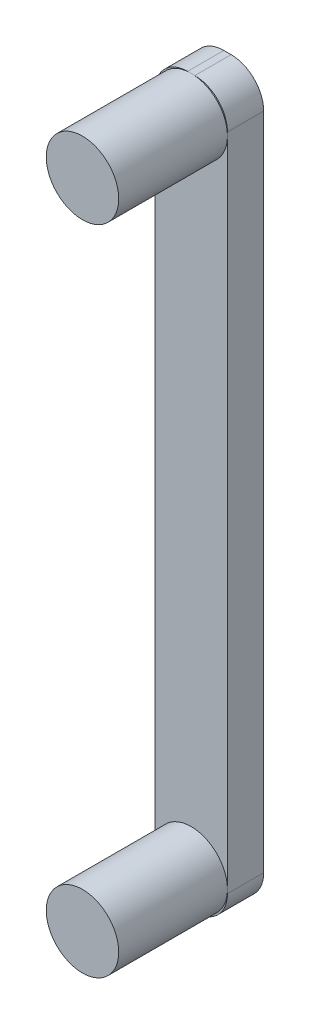
ISO-10303-21;
HEADER;
FILE_DESCRIPTION(('STEP AP214'),'2;1');
FILE_NAME('part.step','',(''),(''),'','','');
FILE_SCHEMA(('AUTOMOTIVE_DESIGN { 1 0 10303 214 1 1 1 1 }'));
ENDSEC;
DATA;
#1=APPLICATION_CONTEXT('core data for automotive mechanical design processes');
#2=APPLICATION_PROTOCOL_DEFINITION('international standard','automotive_design',2000,#1);
#3=PRODUCT_CONTEXT('',#1,'mechanical');
#4=PRODUCT('Part','Part','',(#3));
#5=PRODUCT_RELATED_PRODUCT_CATEGORY('part','',(#4));
#6=PRODUCT_DEFINITION_FORMATION('','',#4);
#7=PRODUCT_DEFINITION_CONTEXT('part definition',#1,'design');
#8=PRODUCT_DEFINITION('design','',#6,#7);
#9=PRODUCT_DEFINITION_SHAPE('','',#8);
#10=(LENGTH_UNIT() NAMED_UNIT(*) SI_UNIT(.MILLI.,.METRE.));
#11=(NAMED_UNIT(*) PLANE_ANGLE_UNIT() SI_UNIT($,.RADIAN.));
#12=(NAMED_UNIT(*) SI_UNIT($,.STERADIAN.) SOLID_ANGLE_UNIT());
#13=UNCERTAINTY_MEASURE_WITH_UNIT(LENGTH_MEASURE(1.E-05),#10,'distance_accuracy_value','');
#14=(GEOMETRIC_REPRESENTATION_CONTEXT(3) GLOBAL_UNCERTAINTY_ASSIGNED_CONTEXT((#13)) GLOBAL_UNIT_ASSIGNED_CONTEXT((#10,
#11,#12)) REPRESENTATION_CONTEXT('',''));
#15=CARTESIAN_POINT('',(0.,0.,0.));
#16=DIRECTION('',(0.,0.,1.));
#17=DIRECTION('',(1.,0.,0.));
#18=AXIS2_PLACEMENT_3D('',#15,#16,#17);
#19=CARTESIAN_POINT('',(-0.099999999999999,-9.1,1.));
#20=DIRECTION('',(0.,0.,1.));
#21=DIRECTION('',(1.,0.,0.));
#22=AXIS2_PLACEMENT_3D('',#19,#20,#21);
#23=PLANE('',#22);
#24=DIRECTION('',(0.,1.,0.));
#25=VECTOR('',#24,1.);
#26=CARTESIAN_POINT('',(0.999999999999999,9.09999999999999,1.));
#27=LINE('',#26,#25);
#28=CARTESIAN_POINT('',(1.,-9.1,1.));
#29=VERTEX_POINT('',#28);
#30=CARTESIAN_POINT('',(1.,-8.99720856712834,1.));
#31=VERTEX_POINT('',#30);
#32=EDGE_CURVE('E124',#29,#31,#27,.T.);
#33=ORIENTED_EDGE('',*,*,#32,.T.);
#34=CARTESIAN_POINT('',(0.,-8.99720856712834,1.));
#35=DIRECTION('',(0.,0.,1.));
#36=DIRECTION('',(1.,0.,0.));
#37=AXIS2_PLACEMENT_3D('',#34,#35,#36);
#38=CIRCLE('',#37,1.);
#39=CARTESIAN_POINT('',(-1.,-8.99720856712834,1.));
#40=VERTEX_POINT('',#39);
#41=EDGE_CURVE('E11',#31,#40,#38,.F.);
#42=ORIENTED_EDGE('',*,*,#41,.T.);
#43=DIRECTION('',(0.,-1.,0.));
#44=VECTOR('',#43,1.);
#45=CARTESIAN_POINT('',(-1.,9.09999999999999,1.));
#46=LINE('',#45,#44);
#47=CARTESIAN_POINT('',(-0.999999999999999,-9.1,1.));
#48=VERTEX_POINT('',#47);
#49=EDGE_CURVE('E121',#40,#48,#46,.T.);
#50=ORIENTED_EDGE('',*,*,#49,.T.);
#51=CARTESIAN_POINT('',(-0.099999999999999,-9.1,1.));
#52=DIRECTION('',(0.,0.,1.));
#53=DIRECTION('',(1.,0.,0.));
#54=AXIS2_PLACEMENT_3D('',#51,#52,#53);
#55=CIRCLE('',#54,0.9);
#56=CARTESIAN_POINT('',(-0.0999999999999923,-10.,1.));
#57=VERTEX_POINT('',#56);
#58=EDGE_CURVE('E158',#48,#57,#55,.T.);
#59=ORIENTED_EDGE('',*,*,#58,.T.);
#60=DIRECTION('',(1.,0.,0.));
#61=VECTOR('',#60,1.);
#62=CARTESIAN_POINT('',(-0.0999999999999923,-10.,1.));
#63=LINE('',#62,#61);
#64=CARTESIAN_POINT('',(0.0999999999999949,-10.,1.));
#65=VERTEX_POINT('',#64);
#66=EDGE_CURVE('E299',#57,#65,#63,.T.);
#67=ORIENTED_EDGE('',*,*,#66,.T.);
#68=CARTESIAN_POINT('',(0.100000000000001,-9.1,1.));
#69=DIRECTION('',(0.,0.,1.));
#70=DIRECTION('',(1.,0.,0.));
#71=AXIS2_PLACEMENT_3D('',#68,#69,#70);
#72=CIRCLE('',#71,0.9);
#73=EDGE_CURVE('E298',#65,#29,#72,.T.);
#74=ORIENTED_EDGE('',*,*,#73,.T.);
#75=EDGE_LOOP('',(#33,#42,#50,#59,#67,#74));
#76=FACE_BOUND('',#75,.T.);
#77=ADVANCED_FACE('F33',(#76),#23,.T.);
#78=CARTESIAN_POINT('',(0.,9.00369428928544,1.));
#79=DIRECTION('',(0.,0.,1.));
#80=DIRECTION('',(1.,0.,0.));
#81=AXIS2_PLACEMENT_3D('',#78,#79,#80);
#82=CIRCLE('',#81,1.);
#83=CARTESIAN_POINT('',(1.,9.00369428928544,1.));
#84=VERTEX_POINT('',#83);
#85=CARTESIAN_POINT('',(0.0858774172734449,10.,1.));
#86=VERTEX_POINT('',#85);
#87=EDGE_CURVE('E255',#84,#86,#82,.T.);
#88=ORIENTED_EDGE('',*,*,#87,.F.);
#89=CARTESIAN_POINT('',(0.999999999999999,9.09999999999999,1.));
#90=VERTEX_POINT('',#89);
#91=EDGE_CURVE('E297',#84,#90,#27,.T.);
#92=ORIENTED_EDGE('',*,*,#91,.T.);
#93=CARTESIAN_POINT('',(0.0999999999999992,9.1,1.));
#94=DIRECTION('',(0.,0.,1.));
#95=DIRECTION('',(-1.,0.,0.));
#96=AXIS2_PLACEMENT_3D('',#93,#94,#95);
#97=CIRCLE('',#96,0.9);
#98=CARTESIAN_POINT('',(0.0999999999999928,10.,1.));
#99=VERTEX_POINT('',#98);
#100=EDGE_CURVE('E251',#90,#99,#97,.T.);
#101=ORIENTED_EDGE('',*,*,#100,.T.);
#102=DIRECTION('',(-1.,0.,0.));
#103=VECTOR('',#102,1.);
#104=CARTESIAN_POINT('',(-0.0999999999999947,10.,1.));
#105=LINE('',#104,#103);
#106=EDGE_CURVE('E192',#99,#86,#105,.T.);
#107=ORIENTED_EDGE('',*,*,#106,.T.);
#108=EDGE_LOOP('',(#88,#92,#101,#107));
#109=FACE_BOUND('',#108,.T.);
#110=ADVANCED_FACE('F226',(#109),#23,.T.);
#111=CARTESIAN_POINT('',(-0.0858774172734449,10.,1.));
#112=VERTEX_POINT('',#111);
#113=CARTESIAN_POINT('',(-1.,9.00369428928544,1.));
#114=VERTEX_POINT('',#113);
#115=EDGE_CURVE('E41',#112,#114,#82,.T.);
#116=ORIENTED_EDGE('',*,*,#115,.F.);
#117=CARTESIAN_POINT('',(-0.0999999999999948,10.,1.));
#118=VERTEX_POINT('',#117);
#119=EDGE_CURVE('E247',#112,#118,#105,.T.);
#120=ORIENTED_EDGE('',*,*,#119,.T.);
#121=CARTESIAN_POINT('',(-0.100000000000001,9.1,1.));
#122=DIRECTION('',(0.,0.,1.));
#123=DIRECTION('',(1.,0.,0.));
#124=AXIS2_PLACEMENT_3D('',#121,#122,#123);
#125=CIRCLE('',#124,0.9);
#126=CARTESIAN_POINT('',(-1.,9.09999999999999,1.));
#127=VERTEX_POINT('',#126);
#128=EDGE_CURVE('E133',#118,#127,#125,.T.);
#129=ORIENTED_EDGE('',*,*,#128,.T.);
#130=EDGE_CURVE('E135',#127,#114,#46,.T.);
#131=ORIENTED_EDGE('',*,*,#130,.T.);
#132=EDGE_LOOP('',(#116,#120,#129,#131));
#133=FACE_BOUND('',#132,.T.);
#134=ADVANCED_FACE('F223',(#133),#23,.T.);
#135=CARTESIAN_POINT('',(-0.099999999999999,-9.1,1.));
#136=DIRECTION('',(0.,0.,-1.));
#137=DIRECTION('',(-1.,0.,0.));
#138=AXIS2_PLACEMENT_3D('',#135,#136,#137);
#139=CYLINDRICAL_SURFACE('',#138,0.9);
#140=CARTESIAN_POINT('',(-0.099999999999999,-9.1,0.));
#141=DIRECTION('',(0.,0.,1.));
#142=DIRECTION('',(1.,0.,0.));
#143=AXIS2_PLACEMENT_3D('',#140,#141,#142);
#144=CIRCLE('',#143,0.9);
#145=CARTESIAN_POINT('',(-0.999999999999999,-9.1,0.));
#146=VERTEX_POINT('',#145);
#147=CARTESIAN_POINT('',(-0.0999999999999923,-10.,0.));
#148=VERTEX_POINT('',#147);
#149=EDGE_CURVE('E140',#146,#148,#144,.T.);
#150=ORIENTED_EDGE('',*,*,#149,.T.);
#151=DIRECTION('',(0.,0.,-1.));
#152=VECTOR('',#151,1.);
#153=CARTESIAN_POINT('',(-0.0999999999999923,-10.,1.));
#154=LINE('',#153,#152);
#155=EDGE_CURVE('E178',#57,#148,#154,.T.);
#156=ORIENTED_EDGE('',*,*,#155,.F.);
#157=ORIENTED_EDGE('',*,*,#58,.F.);
#158=DIRECTION('',(0.,0.,-1.));
#159=VECTOR('',#158,1.);
#160=CARTESIAN_POINT('',(-0.999999999999999,-9.1,1.));
#161=LINE('',#160,#159);
#162=EDGE_CURVE('E131',#48,#146,#161,.T.);
#163=ORIENTED_EDGE('',*,*,#162,.T.);
#164=EDGE_LOOP('',(#150,#156,#157,#163));
#165=FACE_BOUND('',#164,.T.);
#166=ADVANCED_FACE('F35',(#165),#139,.T.);
#167=CARTESIAN_POINT('',(-0.0999999999999923,-10.,1.));
#168=DIRECTION('',(0.,1.,0.));
#169=DIRECTION('',(0.,0.,1.));
#170=AXIS2_PLACEMENT_3D('',#167,#168,#169);
#171=PLANE('',#170);
#172=DIRECTION('',(1.,0.,0.));
#173=VECTOR('',#172,1.);
#174=CARTESIAN_POINT('',(-0.0999999999999923,-10.,0.));
#175=LINE('',#174,#173);
#176=CARTESIAN_POINT('',(0.0999999999999949,-10.,0.));
#177=VERTEX_POINT('',#176);
#178=EDGE_CURVE('E143',#148,#177,#175,.T.);
#179=ORIENTED_EDGE('',*,*,#178,.T.);
#180=DIRECTION('',(0.,0.,-1.));
#181=VECTOR('',#180,1.);
#182=CARTESIAN_POINT('',(0.0999999999999949,-10.,1.));
#183=LINE('',#182,#181);
#184=EDGE_CURVE('E175',#65,#177,#183,.T.);
#185=ORIENTED_EDGE('',*,*,#184,.F.);
#186=ORIENTED_EDGE('',*,*,#66,.F.);
#187=ORIENTED_EDGE('',*,*,#155,.T.);
#188=EDGE_LOOP('',(#179,#185,#186,#187));
#189=FACE_BOUND('',#188,.T.);
#190=ADVANCED_FACE('F216',(#189),#171,.F.);
#191=CARTESIAN_POINT('',(0.100000000000001,-9.1,1.));
#192=DIRECTION('',(0.,0.,-1.));
#193=DIRECTION('',(-1.,0.,0.));
#194=AXIS2_PLACEMENT_3D('',#191,#192,#193);
#195=CYLINDRICAL_SURFACE('',#194,0.9);
#196=CARTESIAN_POINT('',(0.100000000000001,-9.1,0.));
#197=DIRECTION('',(0.,0.,1.));
#198=DIRECTION('',(1.,0.,0.));
#199=AXIS2_PLACEMENT_3D('',#196,#197,#198);
#200=CIRCLE('',#199,0.9);
#201=CARTESIAN_POINT('',(1.,-9.1,0.));
#202=VERTEX_POINT('',#201);
#203=EDGE_CURVE('E146',#177,#202,#200,.T.);
#204=ORIENTED_EDGE('',*,*,#203,.T.);
#205=DIRECTION('',(0.,0.,-1.));
#206=VECTOR('',#205,1.);
#207=CARTESIAN_POINT('',(1.,-9.1,1.));
#208=LINE('',#207,#206);
#209=EDGE_CURVE('E172',#29,#202,#208,.T.);
#210=ORIENTED_EDGE('',*,*,#209,.F.);
#211=ORIENTED_EDGE('',*,*,#73,.F.);
#212=ORIENTED_EDGE('',*,*,#184,.T.);
#213=EDGE_LOOP('',(#204,#210,#211,#212));
#214=FACE_BOUND('',#213,.T.);
#215=ADVANCED_FACE('F213',(#214),#195,.T.);
#216=CARTESIAN_POINT('',(0.999999999999999,9.09999999999999,1.));
#217=DIRECTION('',(-1.,0.,0.));
#218=DIRECTION('',(0.,-1.,0.));
#219=AXIS2_PLACEMENT_3D('',#216,#217,#218);
#220=PLANE('',#219);
#221=DIRECTION('',(0.,1.,0.));
#222=VECTOR('',#221,1.);
#223=CARTESIAN_POINT('',(0.999999999999999,9.09999999999999,0.));
#224=LINE('',#223,#222);
#225=CARTESIAN_POINT('',(0.999999999999999,9.09999999999999,0.));
#226=VERTEX_POINT('',#225);
#227=EDGE_CURVE('E148',#202,#226,#224,.T.);
#228=ORIENTED_EDGE('',*,*,#227,.T.);
#229=DIRECTION('',(0.,0.,-1.));
#230=VECTOR('',#229,1.);
#231=CARTESIAN_POINT('',(0.999999999999999,9.09999999999999,1.));
#232=LINE('',#231,#230);
#233=EDGE_CURVE('E169',#90,#226,#232,.T.);
#234=ORIENTED_EDGE('',*,*,#233,.F.);
#235=ORIENTED_EDGE('',*,*,#91,.F.);
#236=EDGE_CURVE('E296',#31,#84,#27,.T.);
#237=ORIENTED_EDGE('',*,*,#236,.F.);
#238=ORIENTED_EDGE('',*,*,#32,.F.);
#239=ORIENTED_EDGE('',*,*,#209,.T.);
#240=EDGE_LOOP('',(#228,#234,#235,#237,#238,#239));
#241=FACE_BOUND('',#240,.T.);
#242=ADVANCED_FACE('F209',(#241),#220,.F.);
#243=CARTESIAN_POINT('',(0.0999999999999992,9.1,1.));
#244=DIRECTION('',(0.,0.,-1.));
#245=DIRECTION('',(-1.,0.,0.));
#246=AXIS2_PLACEMENT_3D('',#243,#244,#245);
#247=CYLINDRICAL_SURFACE('',#246,0.9);
#248=CARTESIAN_POINT('',(0.0999999999999992,9.1,0.));
#249=DIRECTION('',(0.,0.,1.));
#250=DIRECTION('',(-1.,0.,0.));
#251=AXIS2_PLACEMENT_3D('',#248,#249,#250);
#252=CIRCLE('',#251,0.9);
#253=CARTESIAN_POINT('',(0.0999999999999928,10.,0.));
#254=VERTEX_POINT('',#253);
#255=EDGE_CURVE('E150',#226,#254,#252,.T.);
#256=ORIENTED_EDGE('',*,*,#255,.T.);
#257=DIRECTION('',(0.,0.,-1.));
#258=VECTOR('',#257,1.);
#259=CARTESIAN_POINT('',(0.0999999999999928,10.,1.));
#260=LINE('',#259,#258);
#261=EDGE_CURVE('E166',#99,#254,#260,.T.);
#262=ORIENTED_EDGE('',*,*,#261,.F.);
#263=ORIENTED_EDGE('',*,*,#100,.F.);
#264=ORIENTED_EDGE('',*,*,#233,.T.);
#265=EDGE_LOOP('',(#256,#262,#263,#264));
#266=FACE_BOUND('',#265,.T.);
#267=ADVANCED_FACE('F205',(#266),#247,.T.);
#268=CARTESIAN_POINT('',(-0.0999999999999947,10.,1.));
#269=DIRECTION('',(0.,-1.,0.));
#270=DIRECTION('',(0.,0.,-1.));
#271=AXIS2_PLACEMENT_3D('',#268,#269,#270);
#272=PLANE('',#271);
#273=DIRECTION('',(-1.,0.,0.));
#274=VECTOR('',#273,1.);
#275=CARTESIAN_POINT('',(-0.0999999999999947,10.,0.));
#276=LINE('',#275,#274);
#277=CARTESIAN_POINT('',(-0.0999999999999948,10.,0.));
#278=VERTEX_POINT('',#277);
#279=EDGE_CURVE('E152',#254,#278,#276,.T.);
#280=ORIENTED_EDGE('',*,*,#279,.T.);
#281=DIRECTION('',(0.,0.,-1.));
#282=VECTOR('',#281,1.);
#283=CARTESIAN_POINT('',(-0.0999999999999948,10.,1.));
#284=LINE('',#283,#282);
#285=EDGE_CURVE('E163',#118,#278,#284,.T.);
#286=ORIENTED_EDGE('',*,*,#285,.F.);
#287=ORIENTED_EDGE('',*,*,#119,.F.);
#288=CARTESIAN_POINT('',(0.,9.00369428928544,1.));
#289=DIRECTION('',(0.,0.,1.));
#290=DIRECTION('',(0.0858774172734449,0.996305710714559,0.));
#291=AXIS2_PLACEMENT_3D('',#288,#289,#290);
#292=CIRCLE('',#291,1.);
#293=EDGE_CURVE('E186',#86,#112,#292,.T.);
#294=ORIENTED_EDGE('',*,*,#293,.F.);
#295=ORIENTED_EDGE('',*,*,#106,.F.);
#296=ORIENTED_EDGE('',*,*,#261,.T.);
#297=EDGE_LOOP('',(#280,#286,#287,#294,#295,#296));
#298=FACE_BOUND('',#297,.T.);
#299=ADVANCED_FACE('F194',(#298),#272,.F.);
#300=CARTESIAN_POINT('',(-0.100000000000001,9.1,1.));
#301=DIRECTION('',(0.,0.,-1.));
#302=DIRECTION('',(-1.,0.,0.));
#303=AXIS2_PLACEMENT_3D('',#300,#301,#302);
#304=CYLINDRICAL_SURFACE('',#303,0.9);
#305=CARTESIAN_POINT('',(-0.100000000000001,9.1,0.));
#306=DIRECTION('',(0.,0.,1.));
#307=DIRECTION('',(1.,0.,0.));
#308=AXIS2_PLACEMENT_3D('',#305,#306,#307);
#309=CIRCLE('',#308,0.9);
#310=CARTESIAN_POINT('',(-1.,9.09999999999999,0.));
#311=VERTEX_POINT('',#310);
#312=EDGE_CURVE('E154',#278,#311,#309,.T.);
#313=ORIENTED_EDGE('',*,*,#312,.T.);
#314=DIRECTION('',(0.,0.,-1.));
#315=VECTOR('',#314,1.);
#316=CARTESIAN_POINT('',(-1.,9.09999999999999,1.));
#317=LINE('',#316,#315);
#318=EDGE_CURVE('E160',#127,#311,#317,.T.);
#319=ORIENTED_EDGE('',*,*,#318,.F.);
#320=ORIENTED_EDGE('',*,*,#128,.F.);
#321=ORIENTED_EDGE('',*,*,#285,.T.);
#322=EDGE_LOOP('',(#313,#319,#320,#321));
#323=FACE_BOUND('',#322,.T.);
#324=ADVANCED_FACE('F204',(#323),#304,.T.);
#325=CARTESIAN_POINT('',(-1.,9.09999999999999,1.));
#326=DIRECTION('',(1.,0.,0.));
#327=DIRECTION('',(0.,1.,0.));
#328=AXIS2_PLACEMENT_3D('',#325,#326,#327);
#329=PLANE('',#328);
#330=DIRECTION('',(0.,-1.,0.));
#331=VECTOR('',#330,1.);
#332=CARTESIAN_POINT('',(-1.,9.09999999999999,0.));
#333=LINE('',#332,#331);
#334=EDGE_CURVE('E156',#311,#146,#333,.T.);
#335=ORIENTED_EDGE('',*,*,#334,.T.);
#336=ORIENTED_EDGE('',*,*,#162,.F.);
#337=ORIENTED_EDGE('',*,*,#49,.F.);
#338=EDGE_CURVE('E128',#114,#40,#46,.T.);
#339=ORIENTED_EDGE('',*,*,#338,.F.);
#340=ORIENTED_EDGE('',*,*,#130,.F.);
#341=ORIENTED_EDGE('',*,*,#318,.T.);
#342=EDGE_LOOP('',(#335,#336,#337,#339,#340,#341));
#343=FACE_BOUND('',#342,.T.);
#344=ADVANCED_FACE('F126',(#343),#329,.F.);
#345=ORIENTED_EDGE('',*,*,#338,.T.);
#346=CARTESIAN_POINT('',(0.,-8.99720856712834,1.));
#347=DIRECTION('',(0.,0.,1.));
#348=DIRECTION('',(1.,0.,0.));
#349=AXIS2_PLACEMENT_3D('',#346,#347,#348);
#350=CIRCLE('',#349,1.);
#351=EDGE_CURVE('E112',#31,#40,#350,.T.);
#352=ORIENTED_EDGE('',*,*,#351,.F.);
#353=ORIENTED_EDGE('',*,*,#236,.T.);
#354=EDGE_CURVE('E53',#114,#84,#82,.T.);
#355=ORIENTED_EDGE('',*,*,#354,.F.);
#356=EDGE_LOOP('',(#345,#352,#353,#355));
#357=FACE_BOUND('',#356,.T.);
#358=ADVANCED_FACE('F136',(#357),#23,.T.);
#359=CARTESIAN_POINT('',(-0.099999999999999,-9.1,0.));
#360=DIRECTION('',(0.,0.,1.));
#361=DIRECTION('',(1.,0.,0.));
#362=AXIS2_PLACEMENT_3D('',#359,#360,#361);
#363=PLANE('',#362);
#364=ORIENTED_EDGE('',*,*,#149,.F.);
#365=ORIENTED_EDGE('',*,*,#334,.F.);
#366=ORIENTED_EDGE('',*,*,#312,.F.);
#367=ORIENTED_EDGE('',*,*,#279,.F.);
#368=ORIENTED_EDGE('',*,*,#255,.F.);
#369=ORIENTED_EDGE('',*,*,#227,.F.);
#370=ORIENTED_EDGE('',*,*,#203,.F.);
#371=ORIENTED_EDGE('',*,*,#178,.F.);
#372=EDGE_LOOP('',(#364,#365,#366,#367,#368,#369,#370,#371));
#373=FACE_BOUND('',#372,.T.);
#374=ADVANCED_FACE('F235',(#373),#363,.F.);
#375=CARTESIAN_POINT('',(0.,9.00369428928544,4.));
#376=DIRECTION('',(0.,0.,-1.));
#377=DIRECTION('',(-1.,0.,0.));
#378=AXIS2_PLACEMENT_3D('',#375,#376,#377);
#379=CYLINDRICAL_SURFACE('',#378,1.);
#380=CARTESIAN_POINT('',(0.,9.00369428928544,4.));
#381=DIRECTION('',(0.,0.,1.));
#382=DIRECTION('',(1.,0.,0.));
#383=AXIS2_PLACEMENT_3D('',#380,#381,#382);
#384=CIRCLE('',#383,1.);
#385=CARTESIAN_POINT('',(1.,9.00369428928544,4.));
#386=VERTEX_POINT('',#385);
#387=EDGE_CURVE('E144',#386,#386,#384,.T.);
#388=ORIENTED_EDGE('',*,*,#387,.F.);
#389=EDGE_LOOP('',(#388));
#390=FACE_BOUND('',#389,.T.);
#391=ORIENTED_EDGE('',*,*,#87,.T.);
#392=ORIENTED_EDGE('',*,*,#293,.T.);
#393=ORIENTED_EDGE('',*,*,#115,.T.);
#394=ORIENTED_EDGE('',*,*,#354,.T.);
#395=EDGE_LOOP('',(#391,#392,#393,#394));
#396=FACE_BOUND('',#395,.T.);
#397=ADVANCED_FACE('F240',(#390,#396),#379,.T.);
#398=CARTESIAN_POINT('',(0.,9.00369428928544,4.));
#399=DIRECTION('',(0.,0.,1.));
#400=DIRECTION('',(1.,0.,0.));
#401=AXIS2_PLACEMENT_3D('',#398,#399,#400);
#402=PLANE('',#401);
#403=ORIENTED_EDGE('',*,*,#387,.T.);
#404=EDGE_LOOP('',(#403));
#405=FACE_BOUND('',#404,.T.);
#406=ADVANCED_FACE('F271',(#405),#402,.T.);
#407=CARTESIAN_POINT('',(0.,-8.99720856712834,4.));
#408=DIRECTION('',(0.,0.,-1.));
#409=DIRECTION('',(-1.,0.,0.));
#410=AXIS2_PLACEMENT_3D('',#407,#408,#409);
#411=CYLINDRICAL_SURFACE('',#410,1.);
#412=CARTESIAN_POINT('',(0.,-8.99720856712834,4.));
#413=DIRECTION('',(0.,0.,1.));
#414=DIRECTION('',(1.,0.,0.));
#415=AXIS2_PLACEMENT_3D('',#412,#413,#414);
#416=CIRCLE('',#415,1.);
#417=CARTESIAN_POINT('',(1.,-8.99720856712834,4.));
#418=VERTEX_POINT('',#417);
#419=EDGE_CURVE('E115',#418,#418,#416,.T.);
#420=ORIENTED_EDGE('',*,*,#419,.F.);
#421=EDGE_LOOP('',(#420));
#422=FACE_BOUND('',#421,.T.);
#423=ORIENTED_EDGE('',*,*,#351,.T.);
#424=ORIENTED_EDGE('',*,*,#41,.F.);
#425=EDGE_LOOP('',(#423,#424));
#426=FACE_BOUND('',#425,.T.);
#427=ADVANCED_FACE('F113',(#422,#426),#411,.T.);
#428=CARTESIAN_POINT('',(0.,-8.99720856712834,4.));
#429=DIRECTION('',(0.,0.,1.));
#430=DIRECTION('',(1.,0.,0.));
#431=AXIS2_PLACEMENT_3D('',#428,#429,#430);
#432=PLANE('',#431);
#433=ORIENTED_EDGE('',*,*,#419,.T.);
#434=EDGE_LOOP('',(#433));
#435=FACE_BOUND('',#434,.T.);
#436=ADVANCED_FACE('F278',(#435),#432,.T.);
#437=CLOSED_SHELL('',(#77,#110,#134,#166,#190,#215,#242,#267,#299,#324,#344,#358,#374,#397,#406,
#427,#436));
#438=MANIFOLD_SOLID_BREP('B2',#437);
#439=ADVANCED_BREP_SHAPE_REPRESENTATION('',(#18,#438),#14);
#440=SHAPE_DEFINITION_REPRESENTATION(#9,#439);
ENDSEC;
END-ISO-10303-21;
